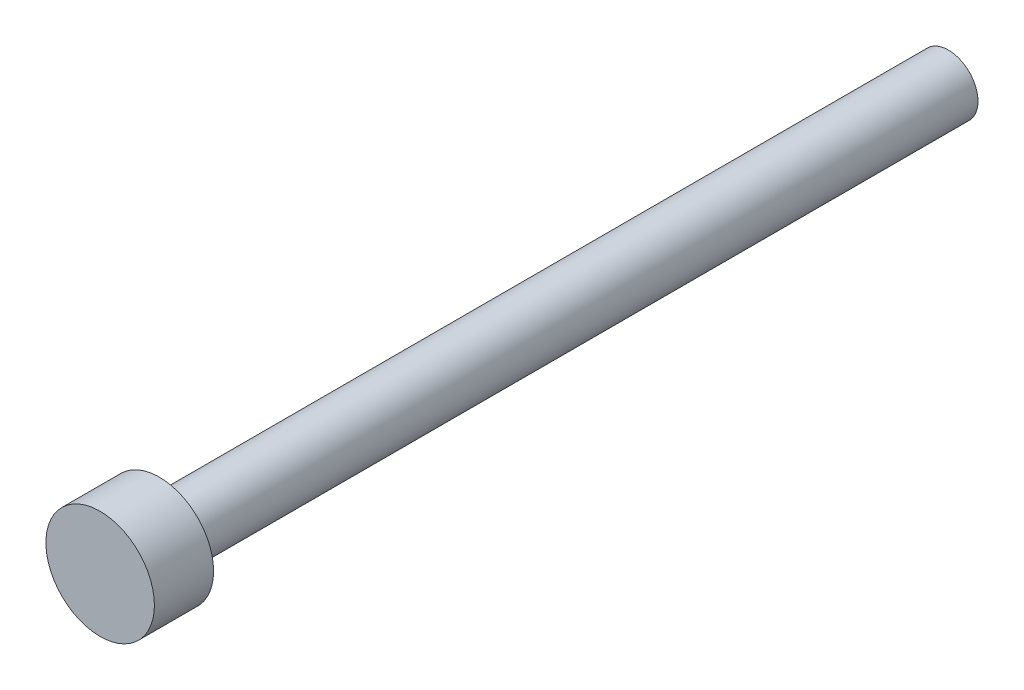
ISO-10303-21;
HEADER;
FILE_DESCRIPTION(('STEP AP214'),'2;1');
FILE_NAME('part.step','',(''),(''),'','','');
FILE_SCHEMA(('AUTOMOTIVE_DESIGN { 1 0 10303 214 1 1 1 1 }'));
ENDSEC;
DATA;
#1=APPLICATION_CONTEXT('core data for automotive mechanical design processes');
#2=APPLICATION_PROTOCOL_DEFINITION('international standard','automotive_design',2000,#1);
#3=PRODUCT_CONTEXT('',#1,'mechanical');
#4=PRODUCT('Part','Part','',(#3));
#5=PRODUCT_RELATED_PRODUCT_CATEGORY('part','',(#4));
#6=PRODUCT_DEFINITION_FORMATION('','',#4);
#7=PRODUCT_DEFINITION_CONTEXT('part definition',#1,'design');
#8=PRODUCT_DEFINITION('design','',#6,#7);
#9=PRODUCT_DEFINITION_SHAPE('','',#8);
#10=(LENGTH_UNIT() NAMED_UNIT(*) SI_UNIT(.MILLI.,.METRE.));
#11=(NAMED_UNIT(*) PLANE_ANGLE_UNIT() SI_UNIT($,.RADIAN.));
#12=(NAMED_UNIT(*) SI_UNIT($,.STERADIAN.) SOLID_ANGLE_UNIT());
#13=UNCERTAINTY_MEASURE_WITH_UNIT(LENGTH_MEASURE(1.E-05),#10,'distance_accuracy_value','');
#14=(GEOMETRIC_REPRESENTATION_CONTEXT(3) GLOBAL_UNCERTAINTY_ASSIGNED_CONTEXT((#13)) GLOBAL_UNIT_ASSIGNED_CONTEXT((#10,
#11,#12)) REPRESENTATION_CONTEXT('',''));
#15=CARTESIAN_POINT('',(0.,0.,0.));
#16=DIRECTION('',(0.,0.,1.));
#17=DIRECTION('',(1.,0.,0.));
#18=AXIS2_PLACEMENT_3D('',#15,#16,#17);
#19=CARTESIAN_POINT('',(0.,0.,0.));
#20=DIRECTION('',(0.,0.,-1.));
#21=DIRECTION('',(-1.,0.,0.));
#22=AXIS2_PLACEMENT_3D('',#19,#20,#21);
#23=CYLINDRICAL_SURFACE('',#22,1.5);
#24=CARTESIAN_POINT('',(0.,0.,0.));
#25=DIRECTION('',(0.,0.,1.));
#26=DIRECTION('',(1.,0.,0.));
#27=AXIS2_PLACEMENT_3D('',#24,#25,#26);
#28=CIRCLE('',#27,1.5);
#29=CARTESIAN_POINT('',(1.5,0.,0.));
#30=VERTEX_POINT('',#29);
#31=EDGE_CURVE('E10',#30,#30,#28,.T.);
#32=ORIENTED_EDGE('',*,*,#31,.F.);
#33=EDGE_LOOP('',(#32));
#34=FACE_BOUND('',#33,.T.);
#35=CARTESIAN_POINT('',(0.,0.,-40.));
#36=DIRECTION('',(0.,0.,1.));
#37=DIRECTION('',(1.,0.,0.));
#38=AXIS2_PLACEMENT_3D('',#35,#36,#37);
#39=CIRCLE('',#38,1.5);
#40=CARTESIAN_POINT('',(1.5,0.,-40.));
#41=VERTEX_POINT('',#40);
#42=EDGE_CURVE('E42',#41,#41,#39,.T.);
#43=ORIENTED_EDGE('',*,*,#42,.T.);
#44=EDGE_LOOP('',(#43));
#45=FACE_BOUND('',#44,.T.);
#46=ADVANCED_FACE('F41',(#34,#45),#23,.T.);
#47=CARTESIAN_POINT('',(0.,0.,-40.));
#48=DIRECTION('',(0.,0.,1.));
#49=DIRECTION('',(1.,0.,0.));
#50=AXIS2_PLACEMENT_3D('',#47,#48,#49);
#51=PLANE('',#50);
#52=ORIENTED_EDGE('',*,*,#42,.F.);
#53=EDGE_LOOP('',(#52));
#54=FACE_BOUND('',#53,.T.);
#55=ADVANCED_FACE('F62',(#54),#51,.F.);
#56=CARTESIAN_POINT('',(0.,0.,3.));
#57=DIRECTION('',(0.,0.,-1.));
#58=DIRECTION('',(-1.,0.,0.));
#59=AXIS2_PLACEMENT_3D('',#56,#57,#58);
#60=CYLINDRICAL_SURFACE('',#59,2.75);
#61=CARTESIAN_POINT('',(0.,0.,3.));
#62=DIRECTION('',(0.,0.,1.));
#63=DIRECTION('',(1.,0.,0.));
#64=AXIS2_PLACEMENT_3D('',#61,#62,#63);
#65=CIRCLE('',#64,2.75);
#66=CARTESIAN_POINT('',(2.75,0.,3.));
#67=VERTEX_POINT('',#66);
#68=EDGE_CURVE('E51',#67,#67,#65,.T.);
#69=ORIENTED_EDGE('',*,*,#68,.F.);
#70=EDGE_LOOP('',(#69));
#71=FACE_BOUND('',#70,.T.);
#72=CARTESIAN_POINT('',(0.,0.,0.));
#73=DIRECTION('',(0.,0.,1.));
#74=DIRECTION('',(1.,0.,0.));
#75=AXIS2_PLACEMENT_3D('',#72,#73,#74);
#76=CIRCLE('',#75,2.75);
#77=CARTESIAN_POINT('',(2.75,0.,0.));
#78=VERTEX_POINT('',#77);
#79=EDGE_CURVE('E52',#78,#78,#76,.T.);
#80=ORIENTED_EDGE('',*,*,#79,.T.);
#81=EDGE_LOOP('',(#80));
#82=FACE_BOUND('',#81,.T.);
#83=ADVANCED_FACE('F63',(#71,#82),#60,.T.);
#84=CARTESIAN_POINT('',(0.,0.,3.));
#85=DIRECTION('',(0.,0.,1.));
#86=DIRECTION('',(1.,0.,0.));
#87=AXIS2_PLACEMENT_3D('',#84,#85,#86);
#88=PLANE('',#87);
#89=ORIENTED_EDGE('',*,*,#68,.T.);
#90=EDGE_LOOP('',(#89));
#91=FACE_BOUND('',#90,.T.);
#92=ADVANCED_FACE('F56',(#91),#88,.T.);
#93=CARTESIAN_POINT('',(0.,0.,0.));
#94=DIRECTION('',(0.,0.,1.));
#95=DIRECTION('',(1.,0.,0.));
#96=AXIS2_PLACEMENT_3D('',#93,#94,#95);
#97=PLANE('',#96);
#98=ORIENTED_EDGE('',*,*,#31,.T.);
#99=EDGE_LOOP('',(#98));
#100=FACE_BOUND('',#99,.T.);
#101=ORIENTED_EDGE('',*,*,#79,.F.);
#102=EDGE_LOOP('',(#101));
#103=FACE_BOUND('',#102,.T.);
#104=ADVANCED_FACE('F66',(#100,#103),#97,.F.);
#105=CLOSED_SHELL('',(#46,#55,#83,#92,#104));
#106=MANIFOLD_SOLID_BREP('B2',#105);
#107=ADVANCED_BREP_SHAPE_REPRESENTATION('',(#18,#106),#14);
#108=SHAPE_DEFINITION_REPRESENTATION(#9,#107);
ENDSEC;
END-ISO-10303-21;
